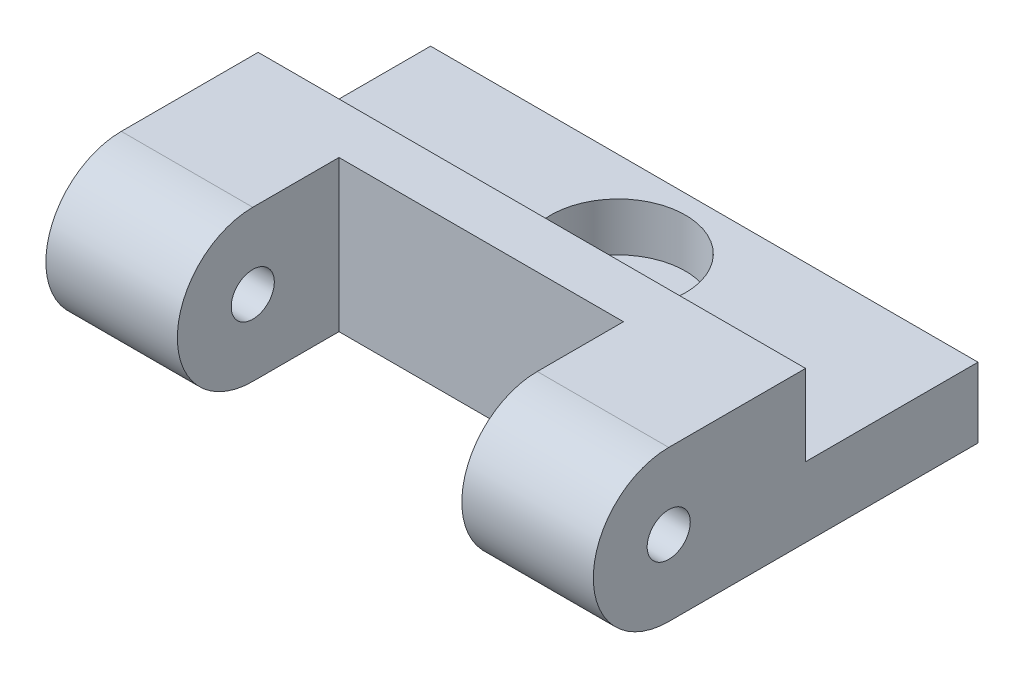
ISO-10303-21;
HEADER;
FILE_DESCRIPTION(('STEP AP214'),'2;1');
FILE_NAME('part.step','',(''),(''),'','','');
FILE_SCHEMA(('AUTOMOTIVE_DESIGN { 1 0 10303 214 1 1 1 1 }'));
ENDSEC;
DATA;
#1=APPLICATION_CONTEXT('core data for automotive mechanical design processes');
#2=APPLICATION_PROTOCOL_DEFINITION('international standard','automotive_design',2000,#1);
#3=PRODUCT_CONTEXT('',#1,'mechanical');
#4=PRODUCT('Part','Part','',(#3));
#5=PRODUCT_RELATED_PRODUCT_CATEGORY('part','',(#4));
#6=PRODUCT_DEFINITION_FORMATION('','',#4);
#7=PRODUCT_DEFINITION_CONTEXT('part definition',#1,'design');
#8=PRODUCT_DEFINITION('design','',#6,#7);
#9=PRODUCT_DEFINITION_SHAPE('','',#8);
#10=(LENGTH_UNIT() NAMED_UNIT(*) SI_UNIT(.MILLI.,.METRE.));
#11=(NAMED_UNIT(*) PLANE_ANGLE_UNIT() SI_UNIT($,.RADIAN.));
#12=(NAMED_UNIT(*) SI_UNIT($,.STERADIAN.) SOLID_ANGLE_UNIT());
#13=UNCERTAINTY_MEASURE_WITH_UNIT(LENGTH_MEASURE(1.E-05),#10,'distance_accuracy_value','');
#14=(GEOMETRIC_REPRESENTATION_CONTEXT(3) GLOBAL_UNCERTAINTY_ASSIGNED_CONTEXT((#13)) GLOBAL_UNIT_ASSIGNED_CONTEXT((#10,
#11,#12)) REPRESENTATION_CONTEXT('',''));
#15=CARTESIAN_POINT('',(0.,0.,0.));
#16=DIRECTION('',(0.,0.,1.));
#17=DIRECTION('',(1.,0.,0.));
#18=AXIS2_PLACEMENT_3D('',#15,#16,#17);
#19=CARTESIAN_POINT('',(12.7,-0.740000074,0.));
#20=DIRECTION('',(0.,1.,0.));
#21=DIRECTION('',(0.,0.,1.));
#22=AXIS2_PLACEMENT_3D('',#19,#20,#21);
#23=PLANE('',#22);
#24=DIRECTION('',(-1.,0.,0.));
#25=VECTOR('',#24,1.);
#26=CARTESIAN_POINT('',(12.7,-0.740000074000004,65.5899999999323));
#27=LINE('',#26,#25);
#28=CARTESIAN_POINT('',(-6.6,-0.740000074000004,65.5899999999323));
#29=VERTEX_POINT('',#28);
#30=CARTESIAN_POINT('',(-12.7,-0.740000074000004,65.5899999999323));
#31=VERTEX_POINT('',#30);
#32=EDGE_CURVE('E56',#29,#31,#27,.T.);
#33=ORIENTED_EDGE('',*,*,#32,.F.);
#34=DIRECTION('',(0.,0.,-1.));
#35=VECTOR('',#34,1.);
#36=CARTESIAN_POINT('',(-6.6,-0.740000074,0.));
#37=LINE('',#36,#35);
#38=CARTESIAN_POINT('',(-6.6,-0.740000074000004,61.5899999999323));
#39=VERTEX_POINT('',#38);
#40=EDGE_CURVE('E221',#29,#39,#37,.T.);
#41=ORIENTED_EDGE('',*,*,#40,.T.);
#42=DIRECTION('',(1.,0.,0.));
#43=VECTOR('',#42,1.);
#44=CARTESIAN_POINT('',(-6.6,-0.740000074000004,61.5899999999323));
#45=LINE('',#44,#43);
#46=CARTESIAN_POINT('',(6.6,-0.740000074000004,61.5899999999323));
#47=VERTEX_POINT('',#46);
#48=EDGE_CURVE('E154',#39,#47,#45,.T.);
#49=ORIENTED_EDGE('',*,*,#48,.T.);
#50=DIRECTION('',(0.,0.,-1.));
#51=VECTOR('',#50,1.);
#52=CARTESIAN_POINT('',(6.6,-0.740000074,0.));
#53=LINE('',#52,#51);
#54=CARTESIAN_POINT('',(6.6,-0.740000074000004,65.5899999999323));
#55=VERTEX_POINT('',#54);
#56=EDGE_CURVE('E225',#55,#47,#53,.T.);
#57=ORIENTED_EDGE('',*,*,#56,.F.);
#58=CARTESIAN_POINT('',(12.7,-0.740000074000004,65.5899999999323));
#59=VERTEX_POINT('',#58);
#60=EDGE_CURVE('E11',#59,#55,#27,.T.);
#61=ORIENTED_EDGE('',*,*,#60,.F.);
#62=DIRECTION('',(0.,0.,-1.));
#63=VECTOR('',#62,1.);
#64=CARTESIAN_POINT('',(12.7,-0.740000074,0.));
#65=LINE('',#64,#63);
#66=CARTESIAN_POINT('',(12.7,-0.740000074000004,59.2399999999323));
#67=VERTEX_POINT('',#66);
#68=EDGE_CURVE('E207',#59,#67,#65,.T.);
#69=ORIENTED_EDGE('',*,*,#68,.T.);
#70=DIRECTION('',(-1.,0.,0.));
#71=VECTOR('',#70,1.);
#72=CARTESIAN_POINT('',(12.7,-0.740000074000004,59.2399999999323));
#73=LINE('',#72,#71);
#74=CARTESIAN_POINT('',(-12.7,-0.740000074000004,59.2399999999323));
#75=VERTEX_POINT('',#74);
#76=EDGE_CURVE('E72',#67,#75,#73,.T.);
#77=ORIENTED_EDGE('',*,*,#76,.T.);
#78=DIRECTION('',(0.,0.,-1.));
#79=VECTOR('',#78,1.);
#80=CARTESIAN_POINT('',(-12.7,-0.740000074,0.));
#81=LINE('',#80,#79);
#82=EDGE_CURVE('E153',#31,#75,#81,.T.);
#83=ORIENTED_EDGE('',*,*,#82,.F.);
#84=EDGE_LOOP('',(#33,#41,#49,#57,#61,#69,#77,#83));
#85=FACE_BOUND('',#84,.T.);
#86=ADVANCED_FACE('F46',(#85),#23,.T.);
#87=CARTESIAN_POINT('',(12.7,-4.240000074,65.5899999999323));
#88=DIRECTION('',(-1.,0.,0.));
#89=DIRECTION('',(0.,0.,1.));
#90=AXIS2_PLACEMENT_3D('',#87,#88,#89);
#91=CYLINDRICAL_SURFACE('',#90,3.5);
#92=CARTESIAN_POINT('',(-6.6,-4.240000074,65.5899999999323));
#93=DIRECTION('',(1.,0.,0.));
#94=DIRECTION('',(0.,0.,-1.));
#95=AXIS2_PLACEMENT_3D('',#92,#93,#94);
#96=CIRCLE('',#95,3.5);
#97=CARTESIAN_POINT('',(-6.6,-7.740000074,65.5899999999323));
#98=VERTEX_POINT('',#97);
#99=EDGE_CURVE('E251',#29,#98,#96,.T.);
#100=ORIENTED_EDGE('',*,*,#99,.F.);
#101=ORIENTED_EDGE('',*,*,#32,.T.);
#102=CARTESIAN_POINT('',(-12.7,-4.240000074,65.5899999999323));
#103=DIRECTION('',(1.,0.,0.));
#104=DIRECTION('',(0.,0.,-1.));
#105=AXIS2_PLACEMENT_3D('',#102,#103,#104);
#106=CIRCLE('',#105,3.5);
#107=CARTESIAN_POINT('',(-12.7,-7.740000074,65.5899999999323));
#108=VERTEX_POINT('',#107);
#109=EDGE_CURVE('E157',#31,#108,#106,.T.);
#110=ORIENTED_EDGE('',*,*,#109,.T.);
#111=DIRECTION('',(-1.,0.,0.));
#112=VECTOR('',#111,1.);
#113=CARTESIAN_POINT('',(12.7,-7.740000074,65.5899999999323));
#114=LINE('',#113,#112);
#115=EDGE_CURVE('E181',#98,#108,#114,.T.);
#116=ORIENTED_EDGE('',*,*,#115,.F.);
#117=EDGE_LOOP('',(#100,#101,#110,#116));
#118=FACE_BOUND('',#117,.T.);
#119=ADVANCED_FACE('F202',(#118),#91,.T.);
#120=CARTESIAN_POINT('',(12.7,-7.74000007399998,0.));
#121=DIRECTION('',(0.,-1.,0.));
#122=DIRECTION('',(0.,0.,-1.));
#123=AXIS2_PLACEMENT_3D('',#120,#121,#122);
#124=PLANE('',#123);
#125=DIRECTION('',(1.,0.,0.));
#126=VECTOR('',#125,1.);
#127=CARTESIAN_POINT('',(-6.6,-7.740000074,61.5899999999323));
#128=LINE('',#127,#126);
#129=CARTESIAN_POINT('',(-6.6,-7.740000074,61.5899999999323));
#130=VERTEX_POINT('',#129);
#131=CARTESIAN_POINT('',(6.6,-7.740000074,61.5899999999323));
#132=VERTEX_POINT('',#131);
#133=EDGE_CURVE('E218',#130,#132,#128,.T.);
#134=ORIENTED_EDGE('',*,*,#133,.F.);
#135=DIRECTION('',(0.,0.,1.));
#136=VECTOR('',#135,1.);
#137=CARTESIAN_POINT('',(-6.6,-7.74000007399998,0.));
#138=LINE('',#137,#136);
#139=EDGE_CURVE('E198',#130,#98,#138,.T.);
#140=ORIENTED_EDGE('',*,*,#139,.T.);
#141=ORIENTED_EDGE('',*,*,#115,.T.);
#142=DIRECTION('',(0.,0.,1.));
#143=VECTOR('',#142,1.);
#144=CARTESIAN_POINT('',(-12.7,-7.74000007399998,0.));
#145=LINE('',#144,#143);
#146=CARTESIAN_POINT('',(-12.7,-7.74000007399999,51.2399999999323));
#147=VERTEX_POINT('',#146);
#148=EDGE_CURVE('E161',#147,#108,#145,.T.);
#149=ORIENTED_EDGE('',*,*,#148,.F.);
#150=DIRECTION('',(-1.,0.,0.));
#151=VECTOR('',#150,1.);
#152=CARTESIAN_POINT('',(12.7,-7.74000007399999,51.2399999999323));
#153=LINE('',#152,#151);
#154=CARTESIAN_POINT('',(12.7,-7.74000007399999,51.2399999999323));
#155=VERTEX_POINT('',#154);
#156=EDGE_CURVE('E127',#155,#147,#153,.T.);
#157=ORIENTED_EDGE('',*,*,#156,.F.);
#158=DIRECTION('',(0.,0.,1.));
#159=VECTOR('',#158,1.);
#160=CARTESIAN_POINT('',(12.7,-7.74000007399998,0.));
#161=LINE('',#160,#159);
#162=CARTESIAN_POINT('',(12.7,-7.740000074,65.5899999999323));
#163=VERTEX_POINT('',#162);
#164=EDGE_CURVE('E138',#155,#163,#161,.T.);
#165=ORIENTED_EDGE('',*,*,#164,.T.);
#166=CARTESIAN_POINT('',(6.6,-7.740000074,65.5899999999323));
#167=VERTEX_POINT('',#166);
#168=EDGE_CURVE('E182',#163,#167,#114,.T.);
#169=ORIENTED_EDGE('',*,*,#168,.T.);
#170=DIRECTION('',(0.,0.,1.));
#171=VECTOR('',#170,1.);
#172=CARTESIAN_POINT('',(6.6,-7.74000007399998,0.));
#173=LINE('',#172,#171);
#174=EDGE_CURVE('E231',#132,#167,#173,.T.);
#175=ORIENTED_EDGE('',*,*,#174,.F.);
#176=EDGE_LOOP('',(#134,#140,#141,#149,#157,#165,#169,#175));
#177=FACE_BOUND('',#176,.T.);
#178=ADVANCED_FACE('F195',(#177),#124,.T.);
#179=CARTESIAN_POINT('',(12.7,-4.240000074,65.5899999999323));
#180=DIRECTION('',(-1.,0.,0.));
#181=DIRECTION('',(0.,0.,1.));
#182=AXIS2_PLACEMENT_3D('',#179,#180,#181);
#183=CYLINDRICAL_SURFACE('',#182,0.999999999999998);
#184=CARTESIAN_POINT('',(-12.7,-4.240000074,65.5899999999323));
#185=DIRECTION('',(1.,0.,0.));
#186=DIRECTION('',(0.,0.,-1.));
#187=AXIS2_PLACEMENT_3D('',#184,#185,#186);
#188=CIRCLE('',#187,0.999999999999998);
#189=CARTESIAN_POINT('',(-12.7,-4.240000074,64.5899999999323));
#190=VERTEX_POINT('',#189);
#191=EDGE_CURVE('E149',#190,#190,#188,.T.);
#192=ORIENTED_EDGE('',*,*,#191,.F.);
#193=EDGE_LOOP('',(#192));
#194=FACE_BOUND('',#193,.T.);
#195=CARTESIAN_POINT('',(-6.6,-4.240000074,65.5899999999323));
#196=DIRECTION('',(1.,0.,0.));
#197=DIRECTION('',(0.,0.,-1.));
#198=AXIS2_PLACEMENT_3D('',#195,#196,#197);
#199=CIRCLE('',#198,0.999999999999998);
#200=CARTESIAN_POINT('',(-6.6,-4.240000074,64.5899999999323));
#201=VERTEX_POINT('',#200);
#202=EDGE_CURVE('E228',#201,#201,#199,.T.);
#203=ORIENTED_EDGE('',*,*,#202,.T.);
#204=EDGE_LOOP('',(#203));
#205=FACE_BOUND('',#204,.T.);
#206=ADVANCED_FACE('F277',(#194,#205),#183,.F.);
#207=ORIENTED_EDGE('',*,*,#60,.T.);
#208=CARTESIAN_POINT('',(6.6,-4.240000074,65.5899999999323));
#209=DIRECTION('',(1.,0.,0.));
#210=DIRECTION('',(0.,0.,-1.));
#211=AXIS2_PLACEMENT_3D('',#208,#209,#210);
#212=CIRCLE('',#211,3.5);
#213=EDGE_CURVE('E234',#55,#167,#212,.T.);
#214=ORIENTED_EDGE('',*,*,#213,.T.);
#215=ORIENTED_EDGE('',*,*,#168,.F.);
#216=CARTESIAN_POINT('',(12.7,-4.240000074,65.5899999999323));
#217=DIRECTION('',(1.,0.,0.));
#218=DIRECTION('',(0.,0.,-1.));
#219=AXIS2_PLACEMENT_3D('',#216,#217,#218);
#220=CIRCLE('',#219,3.5);
#221=EDGE_CURVE('E208',#59,#163,#220,.T.);
#222=ORIENTED_EDGE('',*,*,#221,.F.);
#223=EDGE_LOOP('',(#207,#214,#215,#222));
#224=FACE_BOUND('',#223,.T.);
#225=ADVANCED_FACE('F278',(#224),#91,.T.);
#226=CARTESIAN_POINT('',(12.7,0.,51.2399999999323));
#227=DIRECTION('',(0.,0.,-1.));
#228=DIRECTION('',(-1.,0.,0.));
#229=AXIS2_PLACEMENT_3D('',#226,#227,#228);
#230=PLANE('',#229);
#231=DIRECTION('',(0.,-1.,0.));
#232=VECTOR('',#231,1.);
#233=CARTESIAN_POINT('',(-12.7,0.,51.2399999999323));
#234=LINE('',#233,#232);
#235=CARTESIAN_POINT('',(-12.7,-4.490000074,51.2399999999323));
#236=VERTEX_POINT('',#235);
#237=EDGE_CURVE('E121',#236,#147,#234,.T.);
#238=ORIENTED_EDGE('',*,*,#237,.F.);
#239=DIRECTION('',(-1.,0.,0.));
#240=VECTOR('',#239,1.);
#241=CARTESIAN_POINT('',(12.7,-4.490000074,51.2399999999323));
#242=LINE('',#241,#240);
#243=CARTESIAN_POINT('',(12.7,-4.490000074,51.2399999999323));
#244=VERTEX_POINT('',#243);
#245=EDGE_CURVE('E116',#244,#236,#242,.T.);
#246=ORIENTED_EDGE('',*,*,#245,.F.);
#247=DIRECTION('',(0.,-1.,0.));
#248=VECTOR('',#247,1.);
#249=CARTESIAN_POINT('',(12.7,0.,51.2399999999323));
#250=LINE('',#249,#248);
#251=EDGE_CURVE('E119',#244,#155,#250,.T.);
#252=ORIENTED_EDGE('',*,*,#251,.T.);
#253=ORIENTED_EDGE('',*,*,#156,.T.);
#254=EDGE_LOOP('',(#238,#246,#252,#253));
#255=FACE_BOUND('',#254,.T.);
#256=ADVANCED_FACE('F118',(#255),#230,.T.);
#257=CARTESIAN_POINT('',(12.7,-4.490000074,0.));
#258=DIRECTION('',(0.,1.,0.));
#259=DIRECTION('',(0.,0.,1.));
#260=AXIS2_PLACEMENT_3D('',#257,#258,#259);
#261=PLANE('',#260);
#262=CARTESIAN_POINT('',(0.,-4.490000074,55.2399999999323));
#263=DIRECTION('',(0.,1.,0.));
#264=DIRECTION('',(0.,0.,1.));
#265=AXIS2_PLACEMENT_3D('',#262,#263,#264);
#266=CIRCLE('',#265,3.125);
#267=CARTESIAN_POINT('',(0.,-4.490000074,58.3649999999323));
#268=VERTEX_POINT('',#267);
#269=EDGE_CURVE('E50',#268,#268,#266,.T.);
#270=ORIENTED_EDGE('',*,*,#269,.F.);
#271=EDGE_LOOP('',(#270));
#272=FACE_BOUND('',#271,.T.);
#273=DIRECTION('',(0.,0.,-1.));
#274=VECTOR('',#273,1.);
#275=CARTESIAN_POINT('',(-12.7,-4.490000074,0.));
#276=LINE('',#275,#274);
#277=CARTESIAN_POINT('',(-12.7,-4.490000074,59.2399999999323));
#278=VERTEX_POINT('',#277);
#279=EDGE_CURVE('E167',#278,#236,#276,.T.);
#280=ORIENTED_EDGE('',*,*,#279,.F.);
#281=DIRECTION('',(-1.,0.,0.));
#282=VECTOR('',#281,1.);
#283=CARTESIAN_POINT('',(12.7,-4.490000074,59.2399999999323));
#284=LINE('',#283,#282);
#285=CARTESIAN_POINT('',(12.7,-4.490000074,59.2399999999323));
#286=VERTEX_POINT('',#285);
#287=EDGE_CURVE('E128',#286,#278,#284,.T.);
#288=ORIENTED_EDGE('',*,*,#287,.F.);
#289=DIRECTION('',(0.,0.,-1.));
#290=VECTOR('',#289,1.);
#291=CARTESIAN_POINT('',(12.7,-4.490000074,0.));
#292=LINE('',#291,#290);
#293=EDGE_CURVE('E136',#286,#244,#292,.T.);
#294=ORIENTED_EDGE('',*,*,#293,.T.);
#295=ORIENTED_EDGE('',*,*,#245,.T.);
#296=EDGE_LOOP('',(#280,#288,#294,#295));
#297=FACE_BOUND('',#296,.T.);
#298=ADVANCED_FACE('F141',(#272,#297),#261,.T.);
#299=CARTESIAN_POINT('',(6.6,-4.240000074,65.5899999999323));
#300=DIRECTION('',(1.,0.,0.));
#301=DIRECTION('',(0.,0.,-1.));
#302=AXIS2_PLACEMENT_3D('',#299,#300,#301);
#303=CIRCLE('',#302,0.999999999999998);
#304=CARTESIAN_POINT('',(6.6,-4.240000074,64.5899999999323));
#305=VERTEX_POINT('',#304);
#306=EDGE_CURVE('E238',#305,#305,#303,.T.);
#307=ORIENTED_EDGE('',*,*,#306,.F.);
#308=EDGE_LOOP('',(#307));
#309=FACE_BOUND('',#308,.T.);
#310=CARTESIAN_POINT('',(12.7,-4.240000074,65.5899999999323));
#311=DIRECTION('',(1.,0.,0.));
#312=DIRECTION('',(0.,0.,-1.));
#313=AXIS2_PLACEMENT_3D('',#310,#311,#312);
#314=CIRCLE('',#313,0.999999999999998);
#315=CARTESIAN_POINT('',(12.7,-4.240000074,64.5899999999323));
#316=VERTEX_POINT('',#315);
#317=EDGE_CURVE('E174',#316,#316,#314,.T.);
#318=ORIENTED_EDGE('',*,*,#317,.T.);
#319=EDGE_LOOP('',(#318));
#320=FACE_BOUND('',#319,.T.);
#321=ADVANCED_FACE('F48',(#309,#320),#183,.F.);
#322=CARTESIAN_POINT('',(12.7,0.,59.2399999999323));
#323=DIRECTION('',(0.,0.,-1.));
#324=DIRECTION('',(-1.,0.,0.));
#325=AXIS2_PLACEMENT_3D('',#322,#323,#324);
#326=PLANE('',#325);
#327=DIRECTION('',(0.,-1.,0.));
#328=VECTOR('',#327,1.);
#329=CARTESIAN_POINT('',(-12.7,0.,59.2399999999323));
#330=LINE('',#329,#328);
#331=EDGE_CURVE('E170',#75,#278,#330,.T.);
#332=ORIENTED_EDGE('',*,*,#331,.F.);
#333=ORIENTED_EDGE('',*,*,#76,.F.);
#334=DIRECTION('',(0.,-1.,0.));
#335=VECTOR('',#334,1.);
#336=CARTESIAN_POINT('',(12.7,0.,59.2399999999323));
#337=LINE('',#336,#335);
#338=EDGE_CURVE('E143',#67,#286,#337,.T.);
#339=ORIENTED_EDGE('',*,*,#338,.T.);
#340=ORIENTED_EDGE('',*,*,#287,.T.);
#341=EDGE_LOOP('',(#332,#333,#339,#340));
#342=FACE_BOUND('',#341,.T.);
#343=ADVANCED_FACE('F206',(#342),#326,.T.);
#344=CARTESIAN_POINT('',(12.7,0.,0.));
#345=DIRECTION('',(1.,0.,0.));
#346=DIRECTION('',(0.,0.,-1.));
#347=AXIS2_PLACEMENT_3D('',#344,#345,#346);
#348=PLANE('',#347);
#349=ORIENTED_EDGE('',*,*,#317,.F.);
#350=EDGE_LOOP('',(#349));
#351=FACE_BOUND('',#350,.T.);
#352=ORIENTED_EDGE('',*,*,#68,.F.);
#353=ORIENTED_EDGE('',*,*,#221,.T.);
#354=ORIENTED_EDGE('',*,*,#164,.F.);
#355=ORIENTED_EDGE('',*,*,#251,.F.);
#356=ORIENTED_EDGE('',*,*,#293,.F.);
#357=ORIENTED_EDGE('',*,*,#338,.F.);
#358=EDGE_LOOP('',(#352,#353,#354,#355,#356,#357));
#359=FACE_BOUND('',#358,.T.);
#360=ADVANCED_FACE('F134',(#351,#359),#348,.T.);
#361=CARTESIAN_POINT('',(-12.7,0.,0.));
#362=DIRECTION('',(1.,0.,0.));
#363=DIRECTION('',(0.,0.,-1.));
#364=AXIS2_PLACEMENT_3D('',#361,#362,#363);
#365=PLANE('',#364);
#366=ORIENTED_EDGE('',*,*,#191,.T.);
#367=EDGE_LOOP('',(#366));
#368=FACE_BOUND('',#367,.T.);
#369=ORIENTED_EDGE('',*,*,#82,.T.);
#370=ORIENTED_EDGE('',*,*,#331,.T.);
#371=ORIENTED_EDGE('',*,*,#279,.T.);
#372=ORIENTED_EDGE('',*,*,#237,.T.);
#373=ORIENTED_EDGE('',*,*,#148,.T.);
#374=ORIENTED_EDGE('',*,*,#109,.F.);
#375=EDGE_LOOP('',(#369,#370,#371,#372,#373,#374));
#376=FACE_BOUND('',#375,.T.);
#377=ADVANCED_FACE('F205',(#368,#376),#365,.F.);
#378=CARTESIAN_POINT('',(-6.6,1.22104707297479E-13,61.5899999999323));
#379=DIRECTION('',(0.,0.,1.));
#380=DIRECTION('',(0.,-1.,0.));
#381=AXIS2_PLACEMENT_3D('',#378,#379,#380);
#382=PLANE('',#381);
#383=DIRECTION('',(0.,-1.,0.));
#384=VECTOR('',#383,1.);
#385=CARTESIAN_POINT('',(6.6,1.22104707297479E-13,61.5899999999323));
#386=LINE('',#385,#384);
#387=EDGE_CURVE('E63',#47,#132,#386,.T.);
#388=ORIENTED_EDGE('',*,*,#387,.F.);
#389=ORIENTED_EDGE('',*,*,#48,.F.);
#390=DIRECTION('',(0.,-1.,0.));
#391=VECTOR('',#390,1.);
#392=CARTESIAN_POINT('',(-6.6,1.22104707297479E-13,61.5899999999323));
#393=LINE('',#392,#391);
#394=EDGE_CURVE('E245',#39,#130,#393,.T.);
#395=ORIENTED_EDGE('',*,*,#394,.T.);
#396=ORIENTED_EDGE('',*,*,#133,.T.);
#397=EDGE_LOOP('',(#388,#389,#395,#396));
#398=FACE_BOUND('',#397,.T.);
#399=ADVANCED_FACE('F304',(#398),#382,.T.);
#400=CARTESIAN_POINT('',(-6.6,0.,0.));
#401=DIRECTION('',(1.,0.,0.));
#402=DIRECTION('',(0.,0.,-1.));
#403=AXIS2_PLACEMENT_3D('',#400,#401,#402);
#404=PLANE('',#403);
#405=ORIENTED_EDGE('',*,*,#202,.F.);
#406=EDGE_LOOP('',(#405));
#407=FACE_BOUND('',#406,.T.);
#408=ORIENTED_EDGE('',*,*,#99,.T.);
#409=ORIENTED_EDGE('',*,*,#139,.F.);
#410=ORIENTED_EDGE('',*,*,#394,.F.);
#411=ORIENTED_EDGE('',*,*,#40,.F.);
#412=EDGE_LOOP('',(#408,#409,#410,#411));
#413=FACE_BOUND('',#412,.T.);
#414=ADVANCED_FACE('F300',(#407,#413),#404,.T.);
#415=CARTESIAN_POINT('',(6.6,0.,0.));
#416=DIRECTION('',(1.,0.,0.));
#417=DIRECTION('',(0.,0.,-1.));
#418=AXIS2_PLACEMENT_3D('',#415,#416,#417);
#419=PLANE('',#418);
#420=ORIENTED_EDGE('',*,*,#306,.T.);
#421=EDGE_LOOP('',(#420));
#422=FACE_BOUND('',#421,.T.);
#423=ORIENTED_EDGE('',*,*,#213,.F.);
#424=ORIENTED_EDGE('',*,*,#56,.T.);
#425=ORIENTED_EDGE('',*,*,#387,.T.);
#426=ORIENTED_EDGE('',*,*,#174,.T.);
#427=EDGE_LOOP('',(#423,#424,#425,#426));
#428=FACE_BOUND('',#427,.T.);
#429=ADVANCED_FACE('F303',(#422,#428),#419,.F.);
#430=CARTESIAN_POINT('',(0.,-6.740000074,55.2399999999323));
#431=DIRECTION('',(0.,1.,0.));
#432=DIRECTION('',(0.,0.,1.));
#433=AXIS2_PLACEMENT_3D('',#430,#431,#432);
#434=CYLINDRICAL_SURFACE('',#433,3.125);
#435=ORIENTED_EDGE('',*,*,#269,.T.);
#436=EDGE_LOOP('',(#435));
#437=FACE_BOUND('',#436,.T.);
#438=CARTESIAN_POINT('',(0.,-6.740000074,55.2399999999323));
#439=DIRECTION('',(0.,1.,0.));
#440=DIRECTION('',(0.,0.,1.));
#441=AXIS2_PLACEMENT_3D('',#438,#439,#440);
#442=CIRCLE('',#441,3.125);
#443=CARTESIAN_POINT('',(0.,-6.740000074,58.3649999999323));
#444=VERTEX_POINT('',#443);
#445=EDGE_CURVE('E258',#444,#444,#442,.T.);
#446=ORIENTED_EDGE('',*,*,#445,.F.);
#447=EDGE_LOOP('',(#446));
#448=FACE_BOUND('',#447,.T.);
#449=ADVANCED_FACE('F267',(#437,#448),#434,.F.);
#450=CARTESIAN_POINT('',(0.,-6.740000074,55.2399999999323));
#451=DIRECTION('',(0.,1.,0.));
#452=DIRECTION('',(0.,0.,1.));
#453=AXIS2_PLACEMENT_3D('',#450,#451,#452);
#454=PLANE('',#453);
#455=ORIENTED_EDGE('',*,*,#445,.T.);
#456=EDGE_LOOP('',(#455));
#457=FACE_BOUND('',#456,.T.);
#458=ADVANCED_FACE('F394',(#457),#454,.T.);
#459=CLOSED_SHELL('',(#86,#119,#178,#206,#225,#256,#298,#321,#343,#360,#377,#399,#414,#429,#449,#458));
#460=MANIFOLD_SOLID_BREP('B2',#459);
#461=ADVANCED_BREP_SHAPE_REPRESENTATION('',(#18,#460),#14);
#462=SHAPE_DEFINITION_REPRESENTATION(#9,#461);
ENDSEC;
END-ISO-10303-21;
